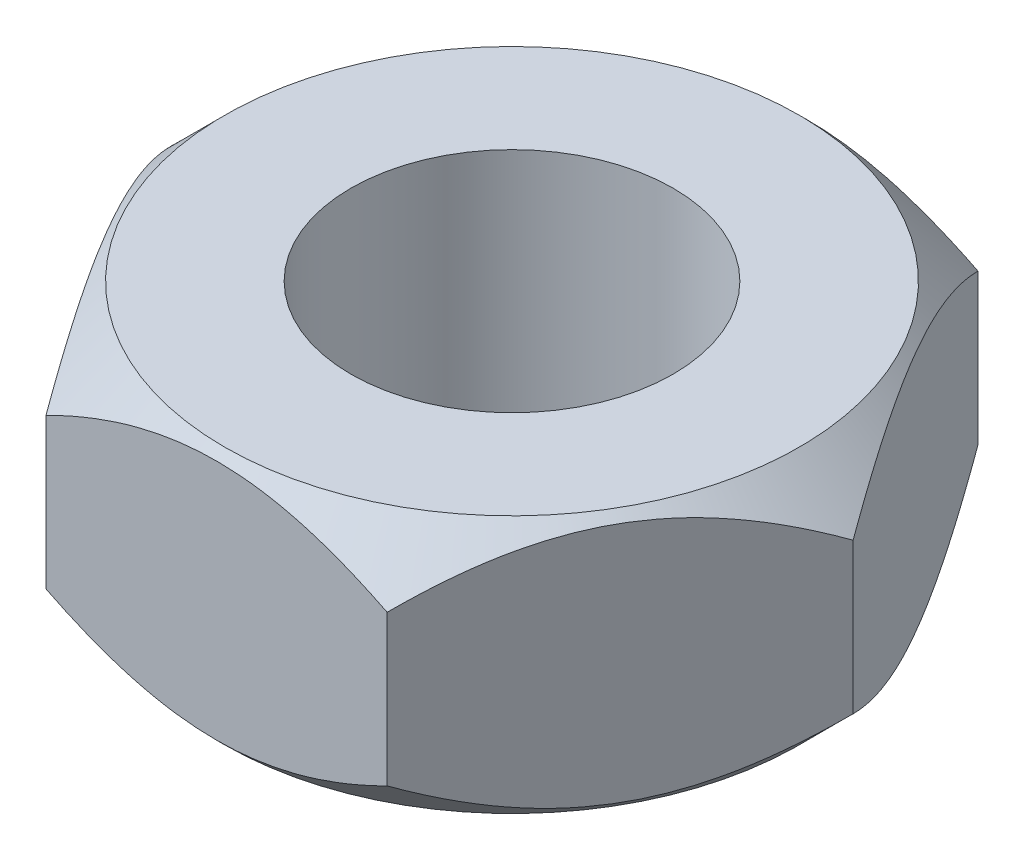
ISO-10303-21;
HEADER;
FILE_DESCRIPTION(('STEP AP214'),'2;1');
FILE_NAME('part.step','',(''),(''),'','','');
FILE_SCHEMA(('AUTOMOTIVE_DESIGN { 1 0 10303 214 1 1 1 1 }'));
ENDSEC;
DATA;
#1=APPLICATION_CONTEXT('core data for automotive mechanical design processes');
#2=APPLICATION_PROTOCOL_DEFINITION('international standard','automotive_design',2000,#1);
#3=PRODUCT_CONTEXT('',#1,'mechanical');
#4=PRODUCT('Part','Part','',(#3));
#5=PRODUCT_RELATED_PRODUCT_CATEGORY('part','',(#4));
#6=PRODUCT_DEFINITION_FORMATION('','',#4);
#7=PRODUCT_DEFINITION_CONTEXT('part definition',#1,'design');
#8=PRODUCT_DEFINITION('design','',#6,#7);
#9=PRODUCT_DEFINITION_SHAPE('','',#8);
#10=(LENGTH_UNIT() NAMED_UNIT(*) SI_UNIT(.MILLI.,.METRE.));
#11=(NAMED_UNIT(*) PLANE_ANGLE_UNIT() SI_UNIT($,.RADIAN.));
#12=(NAMED_UNIT(*) SI_UNIT($,.STERADIAN.) SOLID_ANGLE_UNIT());
#13=UNCERTAINTY_MEASURE_WITH_UNIT(LENGTH_MEASURE(1.E-05),#10,'distance_accuracy_value','');
#14=(GEOMETRIC_REPRESENTATION_CONTEXT(3) GLOBAL_UNCERTAINTY_ASSIGNED_CONTEXT((#13)) GLOBAL_UNIT_ASSIGNED_CONTEXT((#10,
#11,#12)) REPRESENTATION_CONTEXT('',''));
#15=CARTESIAN_POINT('',(0.,0.,0.));
#16=DIRECTION('',(0.,0.,1.));
#17=DIRECTION('',(1.,0.,0.));
#18=AXIS2_PLACEMENT_3D('',#15,#16,#17);
#19=CARTESIAN_POINT('',(0.,0.,0.));
#20=DIRECTION('',(0.,1.,0.));
#21=DIRECTION('',(0.,0.,1.));
#22=AXIS2_PLACEMENT_3D('',#19,#20,#21);
#23=PLANE('',#22);
#24=CARTESIAN_POINT('',(0.,0.,0.));
#25=DIRECTION('',(0.,1.,0.));
#26=DIRECTION('',(0.,0.,1.));
#27=AXIS2_PLACEMENT_3D('',#24,#25,#26);
#28=CIRCLE('',#27,1.5);
#29=CARTESIAN_POINT('',(0.,0.,1.5));
#30=VERTEX_POINT('',#29);
#31=EDGE_CURVE('E114',#30,#30,#28,.T.);
#32=ORIENTED_EDGE('',*,*,#31,.T.);
#33=EDGE_LOOP('',(#32));
#34=FACE_BOUND('',#33,.T.);
#35=CARTESIAN_POINT('',(0.,0.,0.));
#36=DIRECTION('',(0.,1.,0.));
#37=DIRECTION('',(0.,0.,1.));
#38=AXIS2_PLACEMENT_3D('',#35,#36,#37);
#39=CIRCLE('',#38,2.67542648054294);
#40=CARTESIAN_POINT('',(0.,0.,2.67542648054294));
#41=VERTEX_POINT('',#40);
#42=EDGE_CURVE('E297',#41,#41,#39,.T.);
#43=ORIENTED_EDGE('',*,*,#42,.F.);
#44=EDGE_LOOP('',(#43));
#45=FACE_BOUND('',#44,.T.);
#46=ADVANCED_FACE('F34',(#34,#45),#23,.F.);
#47=CARTESIAN_POINT('',(0.,2.4,0.));
#48=DIRECTION('',(0.,1.,0.));
#49=DIRECTION('',(0.,0.,1.));
#50=AXIS2_PLACEMENT_3D('',#47,#48,#49);
#51=PLANE('',#50);
#52=CARTESIAN_POINT('',(0.,2.4,0.));
#53=DIRECTION('',(0.,1.,0.));
#54=DIRECTION('',(0.,0.,1.));
#55=AXIS2_PLACEMENT_3D('',#52,#53,#54);
#56=CIRCLE('',#55,2.67542648054294);
#57=CARTESIAN_POINT('',(0.,2.4,2.67542648054294));
#58=VERTEX_POINT('',#57);
#59=EDGE_CURVE('E299',#58,#58,#56,.T.);
#60=ORIENTED_EDGE('',*,*,#59,.T.);
#61=EDGE_LOOP('',(#60));
#62=FACE_BOUND('',#61,.T.);
#63=CARTESIAN_POINT('',(0.,2.4,0.));
#64=DIRECTION('',(0.,1.,0.));
#65=DIRECTION('',(0.,0.,1.));
#66=AXIS2_PLACEMENT_3D('',#63,#64,#65);
#67=CIRCLE('',#66,1.5);
#68=CARTESIAN_POINT('',(0.,2.4,1.5));
#69=VERTEX_POINT('',#68);
#70=EDGE_CURVE('E109',#69,#69,#67,.T.);
#71=ORIENTED_EDGE('',*,*,#70,.F.);
#72=EDGE_LOOP('',(#71));
#73=FACE_BOUND('',#72,.T.);
#74=ADVANCED_FACE('F208',(#62,#73),#51,.T.);
#75=CARTESIAN_POINT('',(0.,2.4,0.));
#76=DIRECTION('',(0.,-1.,0.));
#77=DIRECTION('',(0.,0.,-1.));
#78=AXIS2_PLACEMENT_3D('',#75,#76,#77);
#79=CYLINDRICAL_SURFACE('',#78,1.5);
#80=ORIENTED_EDGE('',*,*,#70,.T.);
#81=EDGE_LOOP('',(#80));
#82=FACE_BOUND('',#81,.T.);
#83=ORIENTED_EDGE('',*,*,#31,.F.);
#84=EDGE_LOOP('',(#83));
#85=FACE_BOUND('',#84,.T.);
#86=ADVANCED_FACE('F138',(#82,#85),#79,.F.);
#87=CARTESIAN_POINT('',(0.,2.4,0.));
#88=DIRECTION('',(0.,-1.,0.));
#89=DIRECTION('',(0.,0.,-1.));
#90=AXIS2_PLACEMENT_3D('',#87,#88,#89);
#91=CONICAL_SURFACE('',#90,2.67542648054294,0.785398163397448);
#92=ORIENTED_EDGE('',*,*,#59,.F.);
#93=EDGE_LOOP('',(#92));
#94=FACE_BOUND('',#93,.T.);
#95=CARTESIAN_POINT('',(3.17554195059678,1.89988452364802,0.000199999999999201));
#96=CARTESIAN_POINT('',(3.12096451019372,1.95441548689415,-0.0943308997251547));
#97=CARTESIAN_POINT('',(3.06547446347008,2.00574376896024,-0.190442479964884));
#98=CARTESIAN_POINT('',(2.95232415552349,2.09972463246236,-0.386424562220431));
#99=CARTESIAN_POINT('',(2.89465313346251,2.14232492325233,-0.486313702554478));
#100=CARTESIAN_POINT('',(2.77836227110502,2.21530005247799,-0.687735384613649));
#101=CARTESIAN_POINT('',(2.71977204694419,2.24585831086466,-0.789216629687063));
#102=CARTESIAN_POINT('',(2.60130175305013,2.29293964455704,-0.994413197899181));
#103=CARTESIAN_POINT('',(2.54142530239377,2.30949786464364,-1.09812225261289));
#104=CARTESIAN_POINT('',(2.43823122487549,2.32443767266657,-1.27685963791476));
#105=CARTESIAN_POINT('',(2.39504691271491,2.32664922794271,-1.35165706066679));
#106=CARTESIAN_POINT('',(2.30874888176718,2.32292326295546,-1.50112963486141));
#107=CARTESIAN_POINT('',(2.26563519303236,2.31698288583406,-1.57580473425183));
#108=CARTESIAN_POINT('',(2.17981491306544,2.2972911009395,-1.72444981947432));
#109=CARTESIAN_POINT('',(2.13710883164785,2.28353095561553,-1.79841892228175));
#110=CARTESIAN_POINT('',(2.05243516150699,2.24895496192772,-1.94507802102906));
#111=CARTESIAN_POINT('',(2.01046751642768,2.22813965447858,-2.01776811458045));
#112=CARTESIAN_POINT('',(1.90297266759401,2.16634620929449,-2.20395465431229));
#113=CARTESIAN_POINT('',(1.83811191884128,2.12071067201903,-2.31629676656898));
#114=CARTESIAN_POINT('',(1.74273981029545,2.04367184121862,-2.48148610419533));
#115=CARTESIAN_POINT('',(1.71131043208803,2.01660397302297,-2.53592338410088));
#116=CARTESIAN_POINT('',(1.64903383378715,1.96000082884962,-2.64378961648056));
#117=CARTESIAN_POINT('',(1.61818627041469,1.93046706740708,-2.69721916353136));
#118=CARTESIAN_POINT('',(1.58759777021763,1.89988452364802,-2.7502));
#119=B_SPLINE_CURVE_WITH_KNOTS('',3,(#95,#96,#97,#98,#99,#100,#101,#102,#103,#104,#105,#106,
#107,#108,#109,#110,#111,#112,#113,#114,#115,#116,#117,#118),.UNSPECIFIED.,.F.,.F.,(4,2,2,2,2,2,
2,2,2,2,2,4),(0.,0.366307821078204,0.734749902229764,1.09734036165939,1.45901787214334,
1.71784182927395,1.97675651485026,2.23596107357796,2.49514576375462,2.90682558871158,
3.11210731416953,3.31726387159445),.UNSPECIFIED.);
#120=CARTESIAN_POINT('',(3.17542648054294,1.9,0.));
#121=VERTEX_POINT('',#120);
#122=CARTESIAN_POINT('',(1.58771324027147,1.9,-2.75));
#123=VERTEX_POINT('',#122);
#124=EDGE_CURVE('E92',#121,#123,#119,.T.);
#125=ORIENTED_EDGE('',*,*,#124,.T.);
#126=CARTESIAN_POINT('',(4.80246349393579,-0.458663834096488,-2.75));
#127=CARTESIAN_POINT('',(4.66046186903117,-0.335483598346098,-2.75));
#128=CARTESIAN_POINT('',(4.51783064528653,-0.213014225478296,-2.75));
#129=CARTESIAN_POINT('',(4.23082053958588,0.0299958199537691,-2.75));
#130=CARTESIAN_POINT('',(4.08644086128542,0.150535550797828,-2.75));
#131=CARTESIAN_POINT('',(3.7922566928922,0.391786173421253,-2.75));
#132=CARTESIAN_POINT('',(3.64240362503832,0.512438061066801,-2.75));
#133=CARTESIAN_POINT('',(3.33987841524252,0.750093208888949,-2.75));
#134=CARTESIAN_POINT('',(3.18720698854753,0.867097375061134,-2.75));
#135=CARTESIAN_POINT('',(2.87790860415775,1.0962268334365,-2.75));
#136=CARTESIAN_POINT('',(2.72127668003917,1.2083454653902,-2.75));
#137=CARTESIAN_POINT('',(2.40286463497706,1.42540538417046,-2.75));
#138=CARTESIAN_POINT('',(2.24108045370608,1.53034079422894,-2.75));
#139=CARTESIAN_POINT('',(1.91211840905903,1.72855594097767,-2.75));
#140=CARTESIAN_POINT('',(1.74499108927477,1.82191846463911,-2.75));
#141=CARTESIAN_POINT('',(1.40248741959902,1.99200931741501,-2.75));
#142=CARTESIAN_POINT('',(1.22712692945964,2.06876814994707,-2.75));
#143=CARTESIAN_POINT('',(0.955164463920066,2.16553348985623,-2.75));
#144=CARTESIAN_POINT('',(0.861926071509952,2.19494825674981,-2.75));
#145=CARTESIAN_POINT('',(0.673242638526838,2.24567327593216,-2.75));
#146=CARTESIAN_POINT('',(0.57779795256228,2.26698482114192,-2.75));
#147=CARTESIAN_POINT('',(0.38585436358513,2.30008579541206,-2.75));
#148=CARTESIAN_POINT('',(0.289365763254206,2.31193384554894,-2.75));
#149=CARTESIAN_POINT('',(0.0956721682044431,2.32545793340814,-2.75));
#150=CARTESIAN_POINT('',(-0.00153274778287663,2.32713507281772,-2.75));
#151=CARTESIAN_POINT('',(-0.195705600072523,2.32018239402791,-2.75));
#152=CARTESIAN_POINT('',(-0.292672990254146,2.31153766446549,-2.75));
#153=CARTESIAN_POINT('',(-0.48524327038329,2.2845737451677,-2.75));
#154=CARTESIAN_POINT('',(-0.580845885735313,2.26625263593393,-2.75));
#155=CARTESIAN_POINT('',(-0.770670967998542,2.22097982117384,-2.75));
#156=CARTESIAN_POINT('',(-0.864878691741632,2.19396738109448,-2.75));
#157=CARTESIAN_POINT('',(-1.05090172656576,2.13277924444257,-2.75));
#158=CARTESIAN_POINT('',(-1.14271700560248,2.09860345197974,-2.75));
#159=CARTESIAN_POINT('',(-1.34403714041949,2.01622383068671,-2.75));
#160=CARTESIAN_POINT('',(-1.45295172151917,1.96658972023081,-2.75));
#161=CARTESIAN_POINT('',(-1.66754020553079,1.86069859261876,-2.75));
#162=CARTESIAN_POINT('',(-1.77321219624532,1.80443775874147,-2.75));
#163=CARTESIAN_POINT('',(-1.98191177246531,1.68676386018717,-2.75));
#164=CARTESIAN_POINT('',(-2.08493344212876,1.62534038881904,-2.75));
#165=CARTESIAN_POINT('',(-2.28852489829475,1.49862578987341,-2.75));
#166=CARTESIAN_POINT('',(-2.38909516528334,1.43333542896973,-2.75));
#167=CARTESIAN_POINT('',(-2.58873114822565,1.29938066012673,-2.75));
#168=CARTESIAN_POINT('',(-2.68778600055994,1.23070013657744,-2.75));
#169=CARTESIAN_POINT('',(-2.8841812112537,1.09092434329534,-2.75));
#170=CARTESIAN_POINT('',(-2.98152143950371,1.01982889150094,-2.75));
#171=CARTESIAN_POINT('',(-3.27116605110419,0.803846732786965,-2.75));
#172=CARTESIAN_POINT('',(-3.46133467767035,0.656099404572463,-2.75));
#173=CARTESIAN_POINT('',(-3.84633489108075,0.348606096745776,-2.75));
#174=CARTESIAN_POINT('',(-4.04097395108925,0.188621403158712,-2.75));
#175=CARTESIAN_POINT('',(-4.32947605387133,-0.0533341273047493,-2.75));
#176=CARTESIAN_POINT('',(-4.42455204182451,-0.133866002232235,-2.75));
#177=CARTESIAN_POINT('',(-4.61400243374808,-0.295709525365323,-2.75));
#178=CARTESIAN_POINT('',(-4.70837698626373,-0.377020999607074,-2.75));
#179=CARTESIAN_POINT('',(-4.80246349393579,-0.458663834096488,-2.75));
#180=B_SPLINE_CURVE_WITH_KNOTS('',3,(#126,#127,#128,#129,#130,#131,#132,#133,#134,#135,#136,
#137,#138,#139,#140,#141,#142,#143,#144,#145,#146,#147,#148,#149,#150,#151,#152,#153,#154,#155,
#156,#157,#158,#159,#160,#161,#162,#163,#164,#165,#166,#167,#168,#169,#170,#171,#172,#173,#174,
#175,#176,#177,#178,#179),.UNSPECIFIED.,.F.,.F.,(4,2,2,2,2,2,2,2,2,2,2,2,2,2,2,2,2,2,2,2,2,2,2,
2,2,2,4),(0.,0.563963058786177,1.12819343615341,1.70531422110916,2.28229050400187,
2.86003020474256,3.43823705480248,4.01203430294749,4.58476827571136,4.87778080683597,
5.17074656629357,5.46188317833657,5.75298825463715,6.04451438167459,6.33609836033044,
6.62976585472877,6.92343728047941,7.28220610755845,7.64118259061604,8.00090088862966,
8.36054810384703,8.72211046176503,9.08370013865715,9.80600600122354,10.5617969516003,
10.9355894016962,11.3093002980309),.UNSPECIFIED.);
#181=CARTESIAN_POINT('',(-1.58771324027147,1.9,-2.75));
#182=VERTEX_POINT('',#181);
#183=EDGE_CURVE('E105',#123,#182,#180,.T.);
#184=ORIENTED_EDGE('',*,*,#183,.T.);
#185=CARTESIAN_POINT('',(-1.58759777021763,1.89988452364802,-2.7502));
#186=CARTESIAN_POINT('',(-1.64217521062069,1.95441548689415,-2.65566910027485));
#187=CARTESIAN_POINT('',(-1.69766525734434,2.00574376896024,-2.55955752003512));
#188=CARTESIAN_POINT('',(-1.81081556529092,2.09972463246236,-2.36357543777957));
#189=CARTESIAN_POINT('',(-1.8684865873519,2.14232492325233,-2.26368629744552));
#190=CARTESIAN_POINT('',(-1.98477744970939,2.21530005247799,-2.06226461538635));
#191=CARTESIAN_POINT('',(-2.04336767387023,2.24585831086466,-1.96078337031294));
#192=CARTESIAN_POINT('',(-2.16183796776428,2.29293964455704,-1.75558680210082));
#193=CARTESIAN_POINT('',(-2.22171441842064,2.30949786464364,-1.65187774738711));
#194=CARTESIAN_POINT('',(-2.32490849593892,2.32443767266657,-1.47314036208524));
#195=CARTESIAN_POINT('',(-2.3680928080995,2.32664922794271,-1.3983429393332));
#196=CARTESIAN_POINT('',(-2.45439083904723,2.32292326295546,-1.24887036513859));
#197=CARTESIAN_POINT('',(-2.49750452778205,2.31698288583406,-1.17419526574817));
#198=CARTESIAN_POINT('',(-2.58332480774897,2.2972911009395,-1.02555018052568));
#199=CARTESIAN_POINT('',(-2.62603088916656,2.28353095561553,-0.951581077718245));
#200=CARTESIAN_POINT('',(-2.71070455930742,2.24895496192772,-0.804921978970936));
#201=CARTESIAN_POINT('',(-2.75267220438674,2.22813965447857,-0.73223188541955));
#202=CARTESIAN_POINT('',(-2.8601670532204,2.16634620929449,-0.546045345687707));
#203=CARTESIAN_POINT('',(-2.92502780197313,2.12071067201903,-0.433703233431023));
#204=CARTESIAN_POINT('',(-3.02039991051896,2.04367184121862,-0.268513895804667));
#205=CARTESIAN_POINT('',(-3.05182928872638,2.01660397302298,-0.214076615899116));
#206=CARTESIAN_POINT('',(-3.11410588702726,1.96000082884963,-0.106210383519439));
#207=CARTESIAN_POINT('',(-3.14495345039972,1.93046706740708,-0.052780836468639));
#208=CARTESIAN_POINT('',(-3.17554195059678,1.89988452364802,0.00020000000000117));
#209=B_SPLINE_CURVE_WITH_KNOTS('',3,(#185,#186,#187,#188,#189,#190,#191,#192,#193,#194,#195,
#196,#197,#198,#199,#200,#201,#202,#203,#204,#205,#206,#207,#208),.UNSPECIFIED.,.F.,.F.,(4,2,2,
2,2,2,2,2,2,2,2,4),(0.,0.366307821078205,0.734749902229766,1.09734036165939,1.45901787214334,
1.71784182927395,1.97675651485027,2.23596107357796,2.49514576375462,2.90682558871158,
3.11210731416953,3.31726387159445),.UNSPECIFIED.);
#210=CARTESIAN_POINT('',(-3.17542648054294,1.9,0.));
#211=VERTEX_POINT('',#210);
#212=EDGE_CURVE('E161',#182,#211,#209,.T.);
#213=ORIENTED_EDGE('',*,*,#212,.T.);
#214=CARTESIAN_POINT('',(-3.17554195059678,1.89988452364803,-0.000199999999998487));
#215=CARTESIAN_POINT('',(-3.12096451019372,1.95441548689415,0.0943308997251552));
#216=CARTESIAN_POINT('',(-3.06547446347008,2.00574376896024,0.190442479964884));
#217=CARTESIAN_POINT('',(-2.95232415552349,2.09972463246236,0.386424562220432));
#218=CARTESIAN_POINT('',(-2.89465313346251,2.14232492325233,0.486313702554478));
#219=CARTESIAN_POINT('',(-2.77836227110502,2.21530005247799,0.687735384613649));
#220=CARTESIAN_POINT('',(-2.71977204694419,2.24585831086466,0.789216629687064));
#221=CARTESIAN_POINT('',(-2.60130175305013,2.29293964455704,0.994413197899181));
#222=CARTESIAN_POINT('',(-2.54142530239377,2.30949786464364,1.09812225261289));
#223=CARTESIAN_POINT('',(-2.43823122487549,2.32443767266657,1.27685963791476));
#224=CARTESIAN_POINT('',(-2.39504691271491,2.32664922794271,1.35165706066679));
#225=CARTESIAN_POINT('',(-2.30874888176718,2.32292326295546,1.50112963486141));
#226=CARTESIAN_POINT('',(-2.26563519303236,2.31698288583406,1.57580473425183));
#227=CARTESIAN_POINT('',(-2.17981491306544,2.2972911009395,1.72444981947432));
#228=CARTESIAN_POINT('',(-2.13710883164785,2.28353095561553,1.79841892228175));
#229=CARTESIAN_POINT('',(-2.05243516150699,2.24895496192772,1.94507802102906));
#230=CARTESIAN_POINT('',(-2.01046751642768,2.22813965447858,2.01776811458045));
#231=CARTESIAN_POINT('',(-1.90297266759401,2.16634620929449,2.20395465431229));
#232=CARTESIAN_POINT('',(-1.83811191884128,2.12071067201903,2.31629676656898));
#233=CARTESIAN_POINT('',(-1.74273981029545,2.04367184121862,2.48148610419533));
#234=CARTESIAN_POINT('',(-1.71131043208803,2.01660397302297,2.53592338410088));
#235=CARTESIAN_POINT('',(-1.64903383378715,1.96000082884963,2.64378961648056));
#236=CARTESIAN_POINT('',(-1.61818627041469,1.93046706740708,2.69721916353136));
#237=CARTESIAN_POINT('',(-1.58759777021763,1.89988452364802,2.7502));
#238=B_SPLINE_CURVE_WITH_KNOTS('',3,(#214,#215,#216,#217,#218,#219,#220,#221,#222,#223,#224,
#225,#226,#227,#228,#229,#230,#231,#232,#233,#234,#235,#236,#237),.UNSPECIFIED.,.F.,.F.,(4,2,2,
2,2,2,2,2,2,2,2,4),(0.,0.366307821078204,0.734749902229763,1.09734036165939,1.45901787214334,
1.71784182927395,1.97675651485026,2.23596107357796,2.49514576375462,2.90682558871158,
3.11210731416953,3.31726387159445),.UNSPECIFIED.);
#239=CARTESIAN_POINT('',(-1.58771324027147,1.9,2.75));
#240=VERTEX_POINT('',#239);
#241=EDGE_CURVE('E154',#211,#240,#238,.T.);
#242=ORIENTED_EDGE('',*,*,#241,.T.);
#243=CARTESIAN_POINT('',(-4.80246349393579,-0.458663834096488,2.75));
#244=CARTESIAN_POINT('',(-4.66046186903117,-0.335483598346096,2.75));
#245=CARTESIAN_POINT('',(-4.51783064528653,-0.213014225478294,2.75));
#246=CARTESIAN_POINT('',(-4.23082053958588,0.0299958199537702,2.75));
#247=CARTESIAN_POINT('',(-4.08644086128542,0.150535550797829,2.75));
#248=CARTESIAN_POINT('',(-3.7922566928922,0.391786173421254,2.75));
#249=CARTESIAN_POINT('',(-3.64240362503831,0.512438061066802,2.75));
#250=CARTESIAN_POINT('',(-3.33987841524252,0.75009320888895,2.75));
#251=CARTESIAN_POINT('',(-3.18720698854753,0.867097375061134,2.75));
#252=CARTESIAN_POINT('',(-2.87790860415775,1.09622683343651,2.75));
#253=CARTESIAN_POINT('',(-2.72127668003917,1.2083454653902,2.75));
#254=CARTESIAN_POINT('',(-2.40286463497706,1.42540538417046,2.75));
#255=CARTESIAN_POINT('',(-2.24108045370607,1.53034079422894,2.75));
#256=CARTESIAN_POINT('',(-1.91211840905903,1.72855594097767,2.75));
#257=CARTESIAN_POINT('',(-1.74499108927477,1.82191846463911,2.75));
#258=CARTESIAN_POINT('',(-1.40248741959902,1.99200931741501,2.75));
#259=CARTESIAN_POINT('',(-1.22712692945964,2.06876814994707,2.75));
#260=CARTESIAN_POINT('',(-0.955164463920062,2.16553348985623,2.75));
#261=CARTESIAN_POINT('',(-0.861926071509948,2.19494825674981,2.75));
#262=CARTESIAN_POINT('',(-0.673242638526834,2.24567327593216,2.75));
#263=CARTESIAN_POINT('',(-0.577797952562276,2.26698482114192,2.75));
#264=CARTESIAN_POINT('',(-0.385854363585126,2.30008579541206,2.75));
#265=CARTESIAN_POINT('',(-0.289365763254202,2.31193384554894,2.75));
#266=CARTESIAN_POINT('',(-0.0956721682044394,2.32545793340814,2.75));
#267=CARTESIAN_POINT('',(0.0015327477828799,2.32713507281772,2.75));
#268=CARTESIAN_POINT('',(0.195705600072526,2.32018239402791,2.75));
#269=CARTESIAN_POINT('',(0.292672990254149,2.31153766446549,2.75));
#270=CARTESIAN_POINT('',(0.485243270383293,2.2845737451677,2.75));
#271=CARTESIAN_POINT('',(0.580845885735315,2.26625263593393,2.75));
#272=CARTESIAN_POINT('',(0.770670967998545,2.22097982117384,2.75));
#273=CARTESIAN_POINT('',(0.864878691741634,2.19396738109448,2.75));
#274=CARTESIAN_POINT('',(1.05090172656577,2.13277924444257,2.75));
#275=CARTESIAN_POINT('',(1.14271700560249,2.09860345197974,2.75));
#276=CARTESIAN_POINT('',(1.34403714041949,2.01622383068671,2.75));
#277=CARTESIAN_POINT('',(1.45295172151918,1.9665897202308,2.75));
#278=CARTESIAN_POINT('',(1.6675402055308,1.86069859261876,2.75));
#279=CARTESIAN_POINT('',(1.77321219624532,1.80443775874147,2.75));
#280=CARTESIAN_POINT('',(1.98191177246532,1.68676386018717,2.75));
#281=CARTESIAN_POINT('',(2.08493344212876,1.62534038881904,2.75));
#282=CARTESIAN_POINT('',(2.28852489829476,1.49862578987341,2.75));
#283=CARTESIAN_POINT('',(2.38909516528335,1.43333542896973,2.75));
#284=CARTESIAN_POINT('',(2.58873114822566,1.29938066012673,2.75));
#285=CARTESIAN_POINT('',(2.68778600055995,1.23070013657744,2.75));
#286=CARTESIAN_POINT('',(2.88418121125371,1.09092434329534,2.75));
#287=CARTESIAN_POINT('',(2.98152143950372,1.01982889150094,2.75));
#288=CARTESIAN_POINT('',(3.27116605110419,0.803846732786959,2.75));
#289=CARTESIAN_POINT('',(3.46133467767036,0.656099404572457,2.75));
#290=CARTESIAN_POINT('',(3.84633489108076,0.348606096745772,2.75));
#291=CARTESIAN_POINT('',(4.04097395108925,0.188621403158708,2.75));
#292=CARTESIAN_POINT('',(4.32947605387133,-0.0533341273047518,2.75));
#293=CARTESIAN_POINT('',(4.42455204182451,-0.133866002232237,2.75));
#294=CARTESIAN_POINT('',(4.61400243374809,-0.295709525365325,2.75));
#295=CARTESIAN_POINT('',(4.70837698626373,-0.377020999607075,2.75));
#296=CARTESIAN_POINT('',(4.80246349393579,-0.458663834096488,2.75));
#297=B_SPLINE_CURVE_WITH_KNOTS('',3,(#243,#244,#245,#246,#247,#248,#249,#250,#251,#252,#253,
#254,#255,#256,#257,#258,#259,#260,#261,#262,#263,#264,#265,#266,#267,#268,#269,#270,#271,#272,
#273,#274,#275,#276,#277,#278,#279,#280,#281,#282,#283,#284,#285,#286,#287,#288,#289,#290,#291,
#292,#293,#294,#295,#296),.UNSPECIFIED.,.F.,.F.,(4,2,2,2,2,2,2,2,2,2,2,2,2,2,2,2,2,2,2,2,2,2,2,
2,2,2,4),(0.,0.563963058786179,1.12819343615341,1.70531422110916,2.28229050400187,
2.86003020474256,3.43823705480248,4.01203430294749,4.58476827571136,4.87778080683597,
5.17074656629357,5.46188317833658,5.75298825463716,6.04451438167459,6.33609836033044,
6.62976585472877,6.92343728047942,7.28220610755846,7.64118259061604,8.00090088862967,
8.36054810384704,8.72211046176504,9.08370013865716,9.80600600122354,10.5617969516003,
10.9355894016962,11.3093002980309),.UNSPECIFIED.);
#298=CARTESIAN_POINT('',(1.58771324027147,1.9,2.75));
#299=VERTEX_POINT('',#298);
#300=EDGE_CURVE('E56',#240,#299,#297,.T.);
#301=ORIENTED_EDGE('',*,*,#300,.T.);
#302=CARTESIAN_POINT('',(1.58759777021763,1.89988452364802,2.7502));
#303=CARTESIAN_POINT('',(1.64217521062069,1.95441548689415,2.65566910027484));
#304=CARTESIAN_POINT('',(1.69766525734434,2.00574376896024,2.55955752003512));
#305=CARTESIAN_POINT('',(1.81081556529092,2.09972463246236,2.36357543777957));
#306=CARTESIAN_POINT('',(1.8684865873519,2.14232492325233,2.26368629744552));
#307=CARTESIAN_POINT('',(1.98477744970939,2.21530005247799,2.06226461538635));
#308=CARTESIAN_POINT('',(2.04336767387023,2.24585831086466,1.96078337031294));
#309=CARTESIAN_POINT('',(2.16183796776428,2.29293964455704,1.75558680210082));
#310=CARTESIAN_POINT('',(2.22171441842064,2.30949786464364,1.65187774738711));
#311=CARTESIAN_POINT('',(2.32490849593892,2.32443767266657,1.47314036208524));
#312=CARTESIAN_POINT('',(2.3680928080995,2.32664922794271,1.3983429393332));
#313=CARTESIAN_POINT('',(2.45439083904723,2.32292326295546,1.24887036513858));
#314=CARTESIAN_POINT('',(2.49750452778205,2.31698288583406,1.17419526574817));
#315=CARTESIAN_POINT('',(2.58332480774897,2.2972911009395,1.02555018052567));
#316=CARTESIAN_POINT('',(2.62603088916656,2.28353095561553,0.951581077718244));
#317=CARTESIAN_POINT('',(2.71070455930743,2.24895496192772,0.804921978970935));
#318=CARTESIAN_POINT('',(2.75267220438674,2.22813965447857,0.73223188541955));
#319=CARTESIAN_POINT('',(2.8601670532204,2.16634620929449,0.546045345687706));
#320=CARTESIAN_POINT('',(2.92502780197313,2.12071067201903,0.433703233431022));
#321=CARTESIAN_POINT('',(3.02039991051896,2.04367184121862,0.268513895804667));
#322=CARTESIAN_POINT('',(3.05182928872638,2.01660397302297,0.214076615899116));
#323=CARTESIAN_POINT('',(3.11410588702726,1.96000082884963,0.106210383519439));
#324=CARTESIAN_POINT('',(3.14495345039972,1.93046706740708,0.0527808364686394));
#325=CARTESIAN_POINT('',(3.17554195059678,1.89988452364802,-0.000200000000000897));
#326=B_SPLINE_CURVE_WITH_KNOTS('',3,(#302,#303,#304,#305,#306,#307,#308,#309,#310,#311,#312,
#313,#314,#315,#316,#317,#318,#319,#320,#321,#322,#323,#324,#325),.UNSPECIFIED.,.F.,.F.,(4,2,2,
2,2,2,2,2,2,2,2,4),(0.,0.366307821078205,0.734749902229765,1.09734036165939,1.45901787214334,
1.71784182927395,1.97675651485027,2.23596107357796,2.49514576375462,2.90682558871158,
3.11210731416953,3.31726387159445),.UNSPECIFIED.);
#327=EDGE_CURVE('E49',#299,#121,#326,.T.);
#328=ORIENTED_EDGE('',*,*,#327,.T.);
#329=EDGE_LOOP('',(#125,#184,#213,#242,#301,#328));
#330=FACE_BOUND('',#329,.T.);
#331=ADVANCED_FACE('F91',(#94,#330),#91,.T.);
#332=CARTESIAN_POINT('',(0.,0.5,0.));
#333=DIRECTION('',(0.,1.,0.));
#334=DIRECTION('',(0.,0.,1.));
#335=AXIS2_PLACEMENT_3D('',#332,#333,#334);
#336=CONICAL_SURFACE('',#335,3.17542648054294,0.785398163397448);
#337=ORIENTED_EDGE('',*,*,#42,.T.);
#338=EDGE_LOOP('',(#337));
#339=FACE_BOUND('',#338,.T.);
#340=CARTESIAN_POINT('',(1.58759777021763,0.500115476351976,-2.7502));
#341=CARTESIAN_POINT('',(1.64217521062069,0.445584513105854,-2.65566910027485));
#342=CARTESIAN_POINT('',(1.69766525734433,0.394256231039756,-2.55955752003512));
#343=CARTESIAN_POINT('',(1.81081556529092,0.300275367537641,-2.36357543777957));
#344=CARTESIAN_POINT('',(1.8684865873519,0.257675076747672,-2.26368629744552));
#345=CARTESIAN_POINT('',(1.98477744970939,0.184699947522009,-2.06226461538635));
#346=CARTESIAN_POINT('',(2.04336767387023,0.15414168913534,-1.96078337031294));
#347=CARTESIAN_POINT('',(2.16183796776428,0.107060355442955,-1.75558680210082));
#348=CARTESIAN_POINT('',(2.22171441842064,0.0905021353563566,-1.65187774738711));
#349=CARTESIAN_POINT('',(2.32490849593892,0.0755623273334289,-1.47314036208524));
#350=CARTESIAN_POINT('',(2.3680928080995,0.0733507720572852,-1.39834293933321));
#351=CARTESIAN_POINT('',(2.45439083904723,0.0770767370445355,-1.24887036513859));
#352=CARTESIAN_POINT('',(2.49750452778205,0.0830171141659356,-1.17419526574817));
#353=CARTESIAN_POINT('',(2.58332480774897,0.1027088990605,-1.02555018052568));
#354=CARTESIAN_POINT('',(2.62603088916656,0.116469044384472,-0.951581077718247));
#355=CARTESIAN_POINT('',(2.71070455930742,0.151045038072277,-0.804921978970938));
#356=CARTESIAN_POINT('',(2.75267220438674,0.171860345521425,-0.732231885419553));
#357=CARTESIAN_POINT('',(2.8601670532204,0.233653790705512,-0.546045345687709));
#358=CARTESIAN_POINT('',(2.92502780197313,0.279289327980973,-0.433703233431025));
#359=CARTESIAN_POINT('',(3.02039991051896,0.356328158781379,-0.268513895804669));
#360=CARTESIAN_POINT('',(3.05182928872638,0.383396026977025,-0.214076615899119));
#361=CARTESIAN_POINT('',(3.11410588702726,0.439999171150374,-0.106210383519441));
#362=CARTESIAN_POINT('',(3.14495345039972,0.469532932592922,-0.0527808364686411));
#363=CARTESIAN_POINT('',(3.17554195059678,0.500115476351976,0.000199999999999113));
#364=B_SPLINE_CURVE_WITH_KNOTS('',3,(#340,#341,#342,#343,#344,#345,#346,#347,#348,#349,#350,
#351,#352,#353,#354,#355,#356,#357,#358,#359,#360,#361,#362,#363),.UNSPECIFIED.,.F.,.F.,(4,2,2,
2,2,2,2,2,2,2,2,4),(0.,0.366307821078205,0.734749902229765,1.09734036165939,1.45901787214334,
1.71784182927395,1.97675651485026,2.23596107357796,2.49514576375462,2.90682558871158,
3.11210731416953,3.31726387159445),.UNSPECIFIED.);
#365=CARTESIAN_POINT('',(1.58771324027147,0.5,-2.75));
#366=VERTEX_POINT('',#365);
#367=CARTESIAN_POINT('',(3.17542648054294,0.5,0.));
#368=VERTEX_POINT('',#367);
#369=EDGE_CURVE('E63',#366,#368,#364,.T.);
#370=ORIENTED_EDGE('',*,*,#369,.T.);
#371=CARTESIAN_POINT('',(3.17554195059678,0.500115476351975,-0.000200000000000887));
#372=CARTESIAN_POINT('',(3.12096451019372,0.445584513105854,0.0943308997251534));
#373=CARTESIAN_POINT('',(3.06547446347008,0.394256231039756,0.190442479964882));
#374=CARTESIAN_POINT('',(2.95232415552349,0.300275367537641,0.38642456222043));
#375=CARTESIAN_POINT('',(2.89465313346251,0.257675076747672,0.486313702554476));
#376=CARTESIAN_POINT('',(2.77836227110502,0.184699947522009,0.687735384613647));
#377=CARTESIAN_POINT('',(2.71977204694419,0.15414168913534,0.789216629687062));
#378=CARTESIAN_POINT('',(2.60130175305013,0.107060355442956,0.99441319789918));
#379=CARTESIAN_POINT('',(2.54142530239377,0.0905021353563571,1.09812225261289));
#380=CARTESIAN_POINT('',(2.43823122487549,0.0755623273334294,1.27685963791475));
#381=CARTESIAN_POINT('',(2.39504691271491,0.0733507720572856,1.35165706066679));
#382=CARTESIAN_POINT('',(2.30874888176718,0.0770767370445357,1.50112963486141));
#383=CARTESIAN_POINT('',(2.26563519303236,0.0830171141659356,1.57580473425183));
#384=CARTESIAN_POINT('',(2.17981491306544,0.1027088990605,1.72444981947432));
#385=CARTESIAN_POINT('',(2.13710883164786,0.116469044384472,1.79841892228175));
#386=CARTESIAN_POINT('',(2.05243516150699,0.151045038072277,1.94507802102906));
#387=CARTESIAN_POINT('',(2.01046751642768,0.171860345521424,2.01776811458045));
#388=CARTESIAN_POINT('',(1.90297266759401,0.233653790705511,2.20395465431229));
#389=CARTESIAN_POINT('',(1.83811191884129,0.279289327980972,2.31629676656897));
#390=CARTESIAN_POINT('',(1.74273981029545,0.356328158781379,2.48148610419533));
#391=CARTESIAN_POINT('',(1.71131043208803,0.383396026977025,2.53592338410088));
#392=CARTESIAN_POINT('',(1.64903383378715,0.439999171150374,2.64378961648056));
#393=CARTESIAN_POINT('',(1.61818627041469,0.469532932592922,2.69721916353136));
#394=CARTESIAN_POINT('',(1.58759777021763,0.500115476351976,2.7502));
#395=B_SPLINE_CURVE_WITH_KNOTS('',3,(#371,#372,#373,#374,#375,#376,#377,#378,#379,#380,#381,
#382,#383,#384,#385,#386,#387,#388,#389,#390,#391,#392,#393,#394),.UNSPECIFIED.,.F.,.F.,(4,2,2,
2,2,2,2,2,2,2,2,4),(0.,0.366307821078204,0.734749902229764,1.09734036165939,1.45901787214334,
1.71784182927395,1.97675651485026,2.23596107357796,2.49514576375462,2.90682558871158,
3.11210731416953,3.31726387159445),.UNSPECIFIED.);
#396=CARTESIAN_POINT('',(1.58771324027147,0.5,2.75));
#397=VERTEX_POINT('',#396);
#398=EDGE_CURVE('E11',#368,#397,#395,.T.);
#399=ORIENTED_EDGE('',*,*,#398,.T.);
#400=CARTESIAN_POINT('',(4.80246349393579,2.85866383409649,2.75));
#401=CARTESIAN_POINT('',(4.66046186903117,2.7354835983461,2.75));
#402=CARTESIAN_POINT('',(4.51783064528653,2.6130142254783,2.75));
#403=CARTESIAN_POINT('',(4.23082053958588,2.37000418004623,2.75));
#404=CARTESIAN_POINT('',(4.08644086128542,2.24946444920217,2.75));
#405=CARTESIAN_POINT('',(3.7922566928922,2.00821382657875,2.75));
#406=CARTESIAN_POINT('',(3.64240362503832,1.8875619389332,2.75));
#407=CARTESIAN_POINT('',(3.33987841524252,1.64990679111105,2.75));
#408=CARTESIAN_POINT('',(3.18720698854753,1.53290262493887,2.75));
#409=CARTESIAN_POINT('',(2.87790860415775,1.30377316656349,2.75));
#410=CARTESIAN_POINT('',(2.72127668003917,1.1916545346098,2.75));
#411=CARTESIAN_POINT('',(2.40286463497706,0.974594615829536,2.75));
#412=CARTESIAN_POINT('',(2.24108045370608,0.869659205771058,2.75));
#413=CARTESIAN_POINT('',(1.91211840905903,0.671444059022329,2.75));
#414=CARTESIAN_POINT('',(1.74499108927477,0.578081535360893,2.75));
#415=CARTESIAN_POINT('',(1.40248741959902,0.407990682584986,2.75));
#416=CARTESIAN_POINT('',(1.22712692945964,0.331231850052928,2.75));
#417=CARTESIAN_POINT('',(0.955164463920065,0.234466510143771,2.75));
#418=CARTESIAN_POINT('',(0.861926071509951,0.205051743250186,2.75));
#419=CARTESIAN_POINT('',(0.673242638526836,0.154326724067836,2.75));
#420=CARTESIAN_POINT('',(0.577797952562278,0.133015178858081,2.75));
#421=CARTESIAN_POINT('',(0.385854363585129,0.0999142045879392,2.75));
#422=CARTESIAN_POINT('',(0.289365763254204,0.0880661544510632,2.75));
#423=CARTESIAN_POINT('',(0.0956721682044418,0.0745420665918559,2.75));
#424=CARTESIAN_POINT('',(-0.00153274778287754,0.0728649271822823,2.75));
#425=CARTESIAN_POINT('',(-0.195705600072523,0.079817605972086,2.75));
#426=CARTESIAN_POINT('',(-0.292672990254146,0.0884623355345125,2.75));
#427=CARTESIAN_POINT('',(-0.48524327038329,0.115426254832302,2.75));
#428=CARTESIAN_POINT('',(-0.580845885735312,0.133747364066064,2.75));
#429=CARTESIAN_POINT('',(-0.770670967998541,0.179020178826156,2.75));
#430=CARTESIAN_POINT('',(-0.864878691741631,0.206032618905522,2.75));
#431=CARTESIAN_POINT('',(-1.05090172656576,0.267220755557428,2.75));
#432=CARTESIAN_POINT('',(-1.14271700560248,0.301396548020264,2.75));
#433=CARTESIAN_POINT('',(-1.34403714041949,0.383776169313287,2.75));
#434=CARTESIAN_POINT('',(-1.45295172151917,0.433410279769194,2.75));
#435=CARTESIAN_POINT('',(-1.66754020553079,0.539301407381243,2.75));
#436=CARTESIAN_POINT('',(-1.77321219624532,0.595562241258528,2.75));
#437=CARTESIAN_POINT('',(-1.98191177246531,0.713236139812828,2.75));
#438=CARTESIAN_POINT('',(-2.08493344212876,0.774659611180963,2.75));
#439=CARTESIAN_POINT('',(-2.28852489829475,0.90137421012659,2.75));
#440=CARTESIAN_POINT('',(-2.38909516528334,0.966664571030267,2.75));
#441=CARTESIAN_POINT('',(-2.58873114822565,1.10061933987327,2.75));
#442=CARTESIAN_POINT('',(-2.68778600055995,1.16929986342256,2.75));
#443=CARTESIAN_POINT('',(-2.88418121125371,1.30907565670466,2.75));
#444=CARTESIAN_POINT('',(-2.98152143950371,1.38017110849906,2.75));
#445=CARTESIAN_POINT('',(-3.27116605110418,1.59615326721304,2.75));
#446=CARTESIAN_POINT('',(-3.46133467767035,1.74390059542754,2.75));
#447=CARTESIAN_POINT('',(-3.84633489108075,2.05139390325422,2.75));
#448=CARTESIAN_POINT('',(-4.04097395108925,2.21137859684129,2.75));
#449=CARTESIAN_POINT('',(-4.32947605387133,2.45333412730475,2.75));
#450=CARTESIAN_POINT('',(-4.42455204182451,2.53386600223223,2.75));
#451=CARTESIAN_POINT('',(-4.61400243374808,2.69570952536532,2.75));
#452=CARTESIAN_POINT('',(-4.70837698626373,2.77702099960707,2.75));
#453=CARTESIAN_POINT('',(-4.80246349393579,2.85866383409649,2.75));
#454=B_SPLINE_CURVE_WITH_KNOTS('',3,(#400,#401,#402,#403,#404,#405,#406,#407,#408,#409,#410,
#411,#412,#413,#414,#415,#416,#417,#418,#419,#420,#421,#422,#423,#424,#425,#426,#427,#428,#429,
#430,#431,#432,#433,#434,#435,#436,#437,#438,#439,#440,#441,#442,#443,#444,#445,#446,#447,#448,
#449,#450,#451,#452,#453),.UNSPECIFIED.,.F.,.F.,(4,2,2,2,2,2,2,2,2,2,2,2,2,2,2,2,2,2,2,2,2,2,2,
2,2,2,4),(0.,0.563963058786178,1.12819343615341,1.70531422110916,2.28229050400187,
2.86003020474256,3.43823705480248,4.01203430294749,4.58476827571136,4.87778080683597,
5.17074656629357,5.46188317833658,5.75298825463716,6.04451438167459,6.33609836033044,
6.62976585472877,6.92343728047942,7.28220610755846,7.64118259061604,8.00090088862967,
8.36054810384703,8.72211046176504,9.08370013865716,9.80600600122354,10.5617969516003,
10.9355894016962,11.3093002980309),.UNSPECIFIED.);
#455=CARTESIAN_POINT('',(-1.58771324027147,0.5,2.75));
#456=VERTEX_POINT('',#455);
#457=EDGE_CURVE('E104',#397,#456,#454,.T.);
#458=ORIENTED_EDGE('',*,*,#457,.T.);
#459=CARTESIAN_POINT('',(-1.58759777021763,0.500115476351976,2.7502));
#460=CARTESIAN_POINT('',(-1.64217521062069,0.445584513105854,2.65566910027485));
#461=CARTESIAN_POINT('',(-1.69766525734433,0.394256231039756,2.55955752003512));
#462=CARTESIAN_POINT('',(-1.81081556529092,0.300275367537641,2.36357543777957));
#463=CARTESIAN_POINT('',(-1.8684865873519,0.257675076747672,2.26368629744552));
#464=CARTESIAN_POINT('',(-1.98477744970939,0.184699947522009,2.06226461538635));
#465=CARTESIAN_POINT('',(-2.04336767387023,0.15414168913534,1.96078337031294));
#466=CARTESIAN_POINT('',(-2.16183796776428,0.107060355442955,1.75558680210082));
#467=CARTESIAN_POINT('',(-2.22171441842064,0.0905021353563566,1.65187774738711));
#468=CARTESIAN_POINT('',(-2.32490849593892,0.0755623273334289,1.47314036208524));
#469=CARTESIAN_POINT('',(-2.3680928080995,0.0733507720572851,1.39834293933321));
#470=CARTESIAN_POINT('',(-2.45439083904723,0.0770767370445354,1.24887036513859));
#471=CARTESIAN_POINT('',(-2.49750452778205,0.0830171141659355,1.17419526574817));
#472=CARTESIAN_POINT('',(-2.58332480774897,0.1027088990605,1.02555018052568));
#473=CARTESIAN_POINT('',(-2.62603088916656,0.116469044384472,0.951581077718247));
#474=CARTESIAN_POINT('',(-2.71070455930742,0.151045038072277,0.804921978970938));
#475=CARTESIAN_POINT('',(-2.75267220438674,0.171860345521424,0.732231885419553));
#476=CARTESIAN_POINT('',(-2.8601670532204,0.233653790705511,0.546045345687709));
#477=CARTESIAN_POINT('',(-2.92502780197313,0.279289327980972,0.433703233431025));
#478=CARTESIAN_POINT('',(-3.02039991051896,0.356328158781379,0.26851389580467));
#479=CARTESIAN_POINT('',(-3.05182928872638,0.383396026977024,0.214076615899119));
#480=CARTESIAN_POINT('',(-3.11410588702726,0.439999171150373,0.106210383519442));
#481=CARTESIAN_POINT('',(-3.14495345039972,0.469532932592921,0.0527808364686417));
#482=CARTESIAN_POINT('',(-3.17554195059678,0.500115476351975,-0.000199999999998627));
#483=B_SPLINE_CURVE_WITH_KNOTS('',3,(#459,#460,#461,#462,#463,#464,#465,#466,#467,#468,#469,
#470,#471,#472,#473,#474,#475,#476,#477,#478,#479,#480,#481,#482),.UNSPECIFIED.,.F.,.F.,(4,2,2,
2,2,2,2,2,2,2,2,4),(0.,0.366307821078204,0.734749902229764,1.09734036165939,1.45901787214334,
1.71784182927395,1.97675651485026,2.23596107357796,2.49514576375462,2.90682558871158,
3.11210731416953,3.31726387159445),.UNSPECIFIED.);
#484=CARTESIAN_POINT('',(-3.17542648054294,0.5,0.));
#485=VERTEX_POINT('',#484);
#486=EDGE_CURVE('E293',#456,#485,#483,.T.);
#487=ORIENTED_EDGE('',*,*,#486,.T.);
#488=CARTESIAN_POINT('',(-3.17554195059678,0.500115476351975,0.00020000000000152));
#489=CARTESIAN_POINT('',(-3.12096451019372,0.445584513105853,-0.0943308997251525));
#490=CARTESIAN_POINT('',(-3.06547446347008,0.394256231039755,-0.190442479964881));
#491=CARTESIAN_POINT('',(-2.95232415552349,0.30027536753764,-0.386424562220429));
#492=CARTESIAN_POINT('',(-2.89465313346251,0.257675076747672,-0.486313702554475));
#493=CARTESIAN_POINT('',(-2.77836227110502,0.184699947522009,-0.687735384613646));
#494=CARTESIAN_POINT('',(-2.71977204694419,0.15414168913534,-0.789216629687061));
#495=CARTESIAN_POINT('',(-2.60130175305013,0.107060355442955,-0.994413197899179));
#496=CARTESIAN_POINT('',(-2.54142530239377,0.0905021353563567,-1.09812225261289));
#497=CARTESIAN_POINT('',(-2.43823122487549,0.0755623273334291,-1.27685963791475));
#498=CARTESIAN_POINT('',(-2.39504691271491,0.0733507720572852,-1.35165706066679));
#499=CARTESIAN_POINT('',(-2.30874888176718,0.0770767370445353,-1.50112963486141));
#500=CARTESIAN_POINT('',(-2.26563519303236,0.0830171141659352,-1.57580473425183));
#501=CARTESIAN_POINT('',(-2.17981491306544,0.102708899060499,-1.72444981947432));
#502=CARTESIAN_POINT('',(-2.13710883164786,0.116469044384472,-1.79841892228175));
#503=CARTESIAN_POINT('',(-2.05243516150699,0.151045038072277,-1.94507802102906));
#504=CARTESIAN_POINT('',(-2.01046751642768,0.171860345521424,-2.01776811458044));
#505=CARTESIAN_POINT('',(-1.90297266759401,0.233653790705511,-2.20395465431229));
#506=CARTESIAN_POINT('',(-1.83811191884128,0.279289327980972,-2.31629676656897));
#507=CARTESIAN_POINT('',(-1.74273981029545,0.356328158781379,-2.48148610419533));
#508=CARTESIAN_POINT('',(-1.71131043208803,0.383396026977025,-2.53592338410088));
#509=CARTESIAN_POINT('',(-1.64903383378715,0.439999171150374,-2.64378961648056));
#510=CARTESIAN_POINT('',(-1.61818627041469,0.469532932592922,-2.69721916353136));
#511=CARTESIAN_POINT('',(-1.58759777021763,0.500115476351976,-2.7502));
#512=B_SPLINE_CURVE_WITH_KNOTS('',3,(#488,#489,#490,#491,#492,#493,#494,#495,#496,#497,#498,
#499,#500,#501,#502,#503,#504,#505,#506,#507,#508,#509,#510,#511),.UNSPECIFIED.,.F.,.F.,(4,2,2,
2,2,2,2,2,2,2,2,4),(0.,0.366307821078204,0.734749902229763,1.09734036165939,1.45901787214334,
1.71784182927394,1.97675651485026,2.23596107357796,2.49514576375462,2.90682558871158,
3.11210731416953,3.31726387159445),.UNSPECIFIED.);
#513=CARTESIAN_POINT('',(-1.58771324027147,0.5,-2.75));
#514=VERTEX_POINT('',#513);
#515=EDGE_CURVE('E192',#485,#514,#512,.T.);
#516=ORIENTED_EDGE('',*,*,#515,.T.);
#517=CARTESIAN_POINT('',(-4.80246349393579,2.85866383409649,-2.75));
#518=CARTESIAN_POINT('',(-4.66046186903117,2.7354835983461,-2.75));
#519=CARTESIAN_POINT('',(-4.51783064528653,2.6130142254783,-2.75));
#520=CARTESIAN_POINT('',(-4.23082053958588,2.37000418004623,-2.75));
#521=CARTESIAN_POINT('',(-4.08644086128542,2.24946444920217,-2.75));
#522=CARTESIAN_POINT('',(-3.7922566928922,2.00821382657875,-2.75));
#523=CARTESIAN_POINT('',(-3.64240362503832,1.8875619389332,-2.75));
#524=CARTESIAN_POINT('',(-3.33987841524252,1.64990679111105,-2.75));
#525=CARTESIAN_POINT('',(-3.18720698854753,1.53290262493887,-2.75));
#526=CARTESIAN_POINT('',(-2.87790860415775,1.3037731665635,-2.75));
#527=CARTESIAN_POINT('',(-2.72127668003917,1.1916545346098,-2.75));
#528=CARTESIAN_POINT('',(-2.40286463497706,0.974594615829537,-2.75));
#529=CARTESIAN_POINT('',(-2.24108045370608,0.869659205771059,-2.75));
#530=CARTESIAN_POINT('',(-1.91211840905903,0.671444059022329,-2.75));
#531=CARTESIAN_POINT('',(-1.74499108927477,0.578081535360894,-2.75));
#532=CARTESIAN_POINT('',(-1.40248741959902,0.407990682584987,-2.75));
#533=CARTESIAN_POINT('',(-1.22712692945964,0.331231850052929,-2.75));
#534=CARTESIAN_POINT('',(-0.955164463920064,0.234466510143771,-2.75));
#535=CARTESIAN_POINT('',(-0.86192607150995,0.205051743250186,-2.75));
#536=CARTESIAN_POINT('',(-0.673242638526836,0.154326724067837,-2.75));
#537=CARTESIAN_POINT('',(-0.577797952562278,0.133015178858082,-2.75));
#538=CARTESIAN_POINT('',(-0.385854363585128,0.0999142045879401,-2.75));
#539=CARTESIAN_POINT('',(-0.289365763254204,0.0880661544510639,-2.75));
#540=CARTESIAN_POINT('',(-0.0956721682044414,0.0745420665918566,-2.75));
#541=CARTESIAN_POINT('',(0.0015327477828778,0.0728649271822829,-2.75));
#542=CARTESIAN_POINT('',(0.195705600072523,0.0798176059720865,-2.75));
#543=CARTESIAN_POINT('',(0.292672990254146,0.0884623355345131,-2.75));
#544=CARTESIAN_POINT('',(0.48524327038329,0.115426254832303,-2.75));
#545=CARTESIAN_POINT('',(0.580845885735313,0.133747364066066,-2.75));
#546=CARTESIAN_POINT('',(0.770670967998542,0.179020178826157,-2.75));
#547=CARTESIAN_POINT('',(0.864878691741632,0.206032618905523,-2.75));
#548=CARTESIAN_POINT('',(1.05090172656576,0.267220755557428,-2.75));
#549=CARTESIAN_POINT('',(1.14271700560248,0.301396548020265,-2.75));
#550=CARTESIAN_POINT('',(1.34403714041949,0.383776169313288,-2.75));
#551=CARTESIAN_POINT('',(1.45295172151917,0.433410279769195,-2.75));
#552=CARTESIAN_POINT('',(1.66754020553079,0.539301407381243,-2.75));
#553=CARTESIAN_POINT('',(1.77321219624532,0.595562241258528,-2.75));
#554=CARTESIAN_POINT('',(1.98191177246531,0.713236139812828,-2.75));
#555=CARTESIAN_POINT('',(2.08493344212876,0.774659611180963,-2.75));
#556=CARTESIAN_POINT('',(2.28852489829475,0.90137421012659,-2.75));
#557=CARTESIAN_POINT('',(2.38909516528334,0.966664571030267,-2.75));
#558=CARTESIAN_POINT('',(2.58873114822565,1.10061933987327,-2.75));
#559=CARTESIAN_POINT('',(2.68778600055994,1.16929986342256,-2.75));
#560=CARTESIAN_POINT('',(2.8841812112537,1.30907565670466,-2.75));
#561=CARTESIAN_POINT('',(2.98152143950371,1.38017110849906,-2.75));
#562=CARTESIAN_POINT('',(3.27116605110419,1.59615326721304,-2.75));
#563=CARTESIAN_POINT('',(3.46133467767035,1.74390059542754,-2.75));
#564=CARTESIAN_POINT('',(3.84633489108075,2.05139390325422,-2.75));
#565=CARTESIAN_POINT('',(4.04097395108925,2.21137859684129,-2.75));
#566=CARTESIAN_POINT('',(4.32947605387133,2.45333412730475,-2.75));
#567=CARTESIAN_POINT('',(4.42455204182451,2.53386600223224,-2.75));
#568=CARTESIAN_POINT('',(4.61400243374808,2.69570952536532,-2.75));
#569=CARTESIAN_POINT('',(4.70837698626373,2.77702099960707,-2.75));
#570=CARTESIAN_POINT('',(4.80246349393579,2.85866383409649,-2.75));
#571=B_SPLINE_CURVE_WITH_KNOTS('',3,(#517,#518,#519,#520,#521,#522,#523,#524,#525,#526,#527,
#528,#529,#530,#531,#532,#533,#534,#535,#536,#537,#538,#539,#540,#541,#542,#543,#544,#545,#546,
#547,#548,#549,#550,#551,#552,#553,#554,#555,#556,#557,#558,#559,#560,#561,#562,#563,#564,#565,
#566,#567,#568,#569,#570),.UNSPECIFIED.,.F.,.F.,(4,2,2,2,2,2,2,2,2,2,2,2,2,2,2,2,2,2,2,2,2,2,2,
2,2,2,4),(0.,0.563963058786178,1.12819343615341,1.70531422110916,2.28229050400187,
2.86003020474256,3.43823705480248,4.01203430294749,4.58476827571136,4.87778080683597,
5.17074656629357,5.46188317833658,5.75298825463715,6.04451438167459,6.33609836033044,
6.62976585472877,6.92343728047941,7.28220610755845,7.64118259061604,8.00090088862966,
8.36054810384703,8.72211046176503,9.08370013865715,9.80600600122354,10.5617969516003,
10.9355894016962,11.3093002980309),.UNSPECIFIED.);
#572=EDGE_CURVE('E185',#514,#366,#571,.T.);
#573=ORIENTED_EDGE('',*,*,#572,.T.);
#574=EDGE_LOOP('',(#370,#399,#458,#487,#516,#573));
#575=FACE_BOUND('',#574,.T.);
#576=ADVANCED_FACE('F137',(#339,#575),#336,.T.);
#577=CARTESIAN_POINT('',(1.58771324027147,2.4,2.75));
#578=DIRECTION('',(-0.866025403784439,0.,-0.5));
#579=DIRECTION('',(-0.5,0.,0.866025403784439));
#580=AXIS2_PLACEMENT_3D('',#577,#578,#579);
#581=PLANE('',#580);
#582=ORIENTED_EDGE('',*,*,#398,.F.);
#583=DIRECTION('',(0.,-1.,0.));
#584=VECTOR('',#583,1.);
#585=CARTESIAN_POINT('',(3.17542648054294,2.4,0.));
#586=LINE('',#585,#584);
#587=EDGE_CURVE('E102',#121,#368,#586,.T.);
#588=ORIENTED_EDGE('',*,*,#587,.F.);
#589=ORIENTED_EDGE('',*,*,#327,.F.);
#590=DIRECTION('',(0.,-1.,0.));
#591=VECTOR('',#590,1.);
#592=CARTESIAN_POINT('',(1.58771324027147,2.4,2.75));
#593=LINE('',#592,#591);
#594=EDGE_CURVE('E108',#299,#397,#593,.T.);
#595=ORIENTED_EDGE('',*,*,#594,.T.);
#596=EDGE_LOOP('',(#582,#588,#589,#595));
#597=FACE_BOUND('',#596,.T.);
#598=ADVANCED_FACE('F107',(#597),#581,.F.);
#599=CARTESIAN_POINT('',(-1.58771324027147,2.4,2.75));
#600=DIRECTION('',(0.,0.,-1.));
#601=DIRECTION('',(-1.,0.,0.));
#602=AXIS2_PLACEMENT_3D('',#599,#600,#601);
#603=PLANE('',#602);
#604=ORIENTED_EDGE('',*,*,#457,.F.);
#605=ORIENTED_EDGE('',*,*,#594,.F.);
#606=ORIENTED_EDGE('',*,*,#300,.F.);
#607=DIRECTION('',(0.,-1.,0.));
#608=VECTOR('',#607,1.);
#609=CARTESIAN_POINT('',(-1.58771324027147,2.4,2.75));
#610=LINE('',#609,#608);
#611=EDGE_CURVE('E111',#240,#456,#610,.T.);
#612=ORIENTED_EDGE('',*,*,#611,.T.);
#613=EDGE_LOOP('',(#604,#605,#606,#612));
#614=FACE_BOUND('',#613,.T.);
#615=ADVANCED_FACE('F245',(#614),#603,.F.);
#616=CARTESIAN_POINT('',(-3.17542648054294,2.4,0.));
#617=DIRECTION('',(0.866025403784438,0.,-0.5));
#618=DIRECTION('',(-0.5,0.,-0.866025403784439));
#619=AXIS2_PLACEMENT_3D('',#616,#617,#618);
#620=PLANE('',#619);
#621=ORIENTED_EDGE('',*,*,#486,.F.);
#622=ORIENTED_EDGE('',*,*,#611,.F.);
#623=ORIENTED_EDGE('',*,*,#241,.F.);
#624=DIRECTION('',(0.,-1.,0.));
#625=VECTOR('',#624,1.);
#626=CARTESIAN_POINT('',(-3.17542648054294,2.4,0.));
#627=LINE('',#626,#625);
#628=EDGE_CURVE('E120',#211,#485,#627,.T.);
#629=ORIENTED_EDGE('',*,*,#628,.T.);
#630=EDGE_LOOP('',(#621,#622,#623,#629));
#631=FACE_BOUND('',#630,.T.);
#632=ADVANCED_FACE('F253',(#631),#620,.F.);
#633=CARTESIAN_POINT('',(-1.58771324027147,2.4,-2.75));
#634=DIRECTION('',(0.866025403784439,0.,0.499999999999999));
#635=DIRECTION('',(0.5,0.,-0.866025403784439));
#636=AXIS2_PLACEMENT_3D('',#633,#634,#635);
#637=PLANE('',#636);
#638=ORIENTED_EDGE('',*,*,#515,.F.);
#639=ORIENTED_EDGE('',*,*,#628,.F.);
#640=ORIENTED_EDGE('',*,*,#212,.F.);
#641=DIRECTION('',(0.,-1.,0.));
#642=VECTOR('',#641,1.);
#643=CARTESIAN_POINT('',(-1.58771324027147,2.4,-2.75));
#644=LINE('',#643,#642);
#645=EDGE_CURVE('E123',#182,#514,#644,.T.);
#646=ORIENTED_EDGE('',*,*,#645,.T.);
#647=EDGE_LOOP('',(#638,#639,#640,#646));
#648=FACE_BOUND('',#647,.T.);
#649=ADVANCED_FACE('F180',(#648),#637,.F.);
#650=CARTESIAN_POINT('',(1.58771324027147,2.4,-2.75));
#651=DIRECTION('',(0.,0.,1.));
#652=DIRECTION('',(1.,0.,0.));
#653=AXIS2_PLACEMENT_3D('',#650,#651,#652);
#654=PLANE('',#653);
#655=ORIENTED_EDGE('',*,*,#572,.F.);
#656=ORIENTED_EDGE('',*,*,#645,.F.);
#657=ORIENTED_EDGE('',*,*,#183,.F.);
#658=DIRECTION('',(0.,-1.,0.));
#659=VECTOR('',#658,1.);
#660=CARTESIAN_POINT('',(1.58771324027147,2.4,-2.75));
#661=LINE('',#660,#659);
#662=EDGE_CURVE('E98',#123,#366,#661,.T.);
#663=ORIENTED_EDGE('',*,*,#662,.T.);
#664=EDGE_LOOP('',(#655,#656,#657,#663));
#665=FACE_BOUND('',#664,.T.);
#666=ADVANCED_FACE('F177',(#665),#654,.F.);
#667=CARTESIAN_POINT('',(3.17542648054294,2.4,0.));
#668=DIRECTION('',(-0.866025403784438,0.,0.5));
#669=DIRECTION('',(0.5,0.,0.866025403784439));
#670=AXIS2_PLACEMENT_3D('',#667,#668,#669);
#671=PLANE('',#670);
#672=ORIENTED_EDGE('',*,*,#369,.F.);
#673=ORIENTED_EDGE('',*,*,#662,.F.);
#674=ORIENTED_EDGE('',*,*,#124,.F.);
#675=ORIENTED_EDGE('',*,*,#587,.T.);
#676=EDGE_LOOP('',(#672,#673,#674,#675));
#677=FACE_BOUND('',#676,.T.);
#678=ADVANCED_FACE('F36',(#677),#671,.F.);
#679=CLOSED_SHELL('',(#46,#74,#86,#331,#576,#598,#615,#632,#649,#666,#678));
#680=MANIFOLD_SOLID_BREP('B2',#679);
#681=ADVANCED_BREP_SHAPE_REPRESENTATION('',(#18,#680),#14);
#682=SHAPE_DEFINITION_REPRESENTATION(#9,#681);
ENDSEC;
END-ISO-10303-21;
